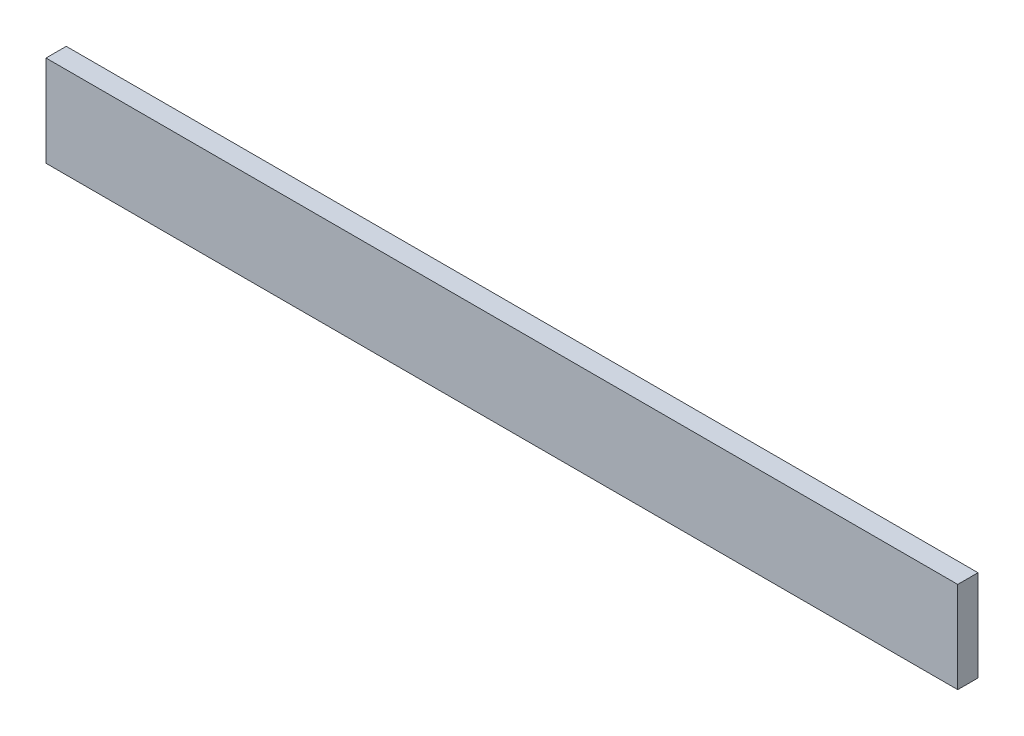
ISO-10303-21;
HEADER;
FILE_DESCRIPTION(('STEP AP214'),'2;1');
FILE_NAME('part.step','',(''),(''),'','','');
FILE_SCHEMA(('AUTOMOTIVE_DESIGN { 1 0 10303 214 1 1 1 1 }'));
ENDSEC;
DATA;
#1=APPLICATION_CONTEXT('core data for automotive mechanical design processes');
#2=APPLICATION_PROTOCOL_DEFINITION('international standard','automotive_design',2000,#1);
#3=PRODUCT_CONTEXT('',#1,'mechanical');
#4=PRODUCT('Part','Part','',(#3));
#5=PRODUCT_RELATED_PRODUCT_CATEGORY('part','',(#4));
#6=PRODUCT_DEFINITION_FORMATION('','',#4);
#7=PRODUCT_DEFINITION_CONTEXT('part definition',#1,'design');
#8=PRODUCT_DEFINITION('design','',#6,#7);
#9=PRODUCT_DEFINITION_SHAPE('','',#8);
#10=(LENGTH_UNIT() NAMED_UNIT(*) SI_UNIT(.MILLI.,.METRE.));
#11=(NAMED_UNIT(*) PLANE_ANGLE_UNIT() SI_UNIT($,.RADIAN.));
#12=(NAMED_UNIT(*) SI_UNIT($,.STERADIAN.) SOLID_ANGLE_UNIT());
#13=UNCERTAINTY_MEASURE_WITH_UNIT(LENGTH_MEASURE(1.E-05),#10,'distance_accuracy_value','');
#14=(GEOMETRIC_REPRESENTATION_CONTEXT(3) GLOBAL_UNCERTAINTY_ASSIGNED_CONTEXT((#13)) GLOBAL_UNIT_ASSIGNED_CONTEXT((#10,
#11,#12)) REPRESENTATION_CONTEXT('',''));
#15=CARTESIAN_POINT('',(0.,0.,0.));
#16=DIRECTION('',(0.,0.,1.));
#17=DIRECTION('',(1.,0.,0.));
#18=AXIS2_PLACEMENT_3D('',#15,#16,#17);
#19=CARTESIAN_POINT('',(154.666666666667,45.,-10.));
#20=DIRECTION('',(1.,0.,0.));
#21=DIRECTION('',(0.,0.,-1.));
#22=AXIS2_PLACEMENT_3D('',#19,#20,#21);
#23=PLANE('',#22);
#24=DIRECTION('',(0.,0.,1.));
#25=VECTOR('',#24,1.);
#26=CARTESIAN_POINT('',(154.666666666667,45.,-10.));
#27=LINE('',#26,#25);
#28=CARTESIAN_POINT('',(154.666666666667,45.,-10.));
#29=VERTEX_POINT('',#28);
#30=CARTESIAN_POINT('',(154.666666666667,45.,10.));
#31=VERTEX_POINT('',#30);
#32=EDGE_CURVE('E36',#29,#31,#27,.T.);
#33=ORIENTED_EDGE('',*,*,#32,.T.);
#34=DIRECTION('',(0.,1.,0.));
#35=VECTOR('',#34,1.);
#36=CARTESIAN_POINT('',(154.666666666667,45.,10.));
#37=LINE('',#36,#35);
#38=CARTESIAN_POINT('',(154.666666666667,-45.,10.));
#39=VERTEX_POINT('',#38);
#40=EDGE_CURVE('E73',#39,#31,#37,.T.);
#41=ORIENTED_EDGE('',*,*,#40,.F.);
#42=DIRECTION('',(0.,0.,1.));
#43=VECTOR('',#42,1.);
#44=CARTESIAN_POINT('',(154.666666666667,-45.,-10.));
#45=LINE('',#44,#43);
#46=CARTESIAN_POINT('',(154.666666666667,-45.,-10.));
#47=VERTEX_POINT('',#46);
#48=EDGE_CURVE('E11',#47,#39,#45,.T.);
#49=ORIENTED_EDGE('',*,*,#48,.F.);
#50=DIRECTION('',(0.,1.,0.));
#51=VECTOR('',#50,1.);
#52=CARTESIAN_POINT('',(154.666666666667,45.,-10.));
#53=LINE('',#52,#51);
#54=EDGE_CURVE('E74',#47,#29,#53,.T.);
#55=ORIENTED_EDGE('',*,*,#54,.T.);
#56=EDGE_LOOP('',(#33,#41,#49,#55));
#57=FACE_BOUND('',#56,.T.);
#58=ADVANCED_FACE('F33',(#57),#23,.T.);
#59=CARTESIAN_POINT('',(-745.333333333333,-45.,-10.));
#60=DIRECTION('',(0.,-1.,0.));
#61=DIRECTION('',(0.,0.,-1.));
#62=AXIS2_PLACEMENT_3D('',#59,#60,#61);
#63=PLANE('',#62);
#64=ORIENTED_EDGE('',*,*,#48,.T.);
#65=DIRECTION('',(1.,0.,0.));
#66=VECTOR('',#65,1.);
#67=CARTESIAN_POINT('',(-745.333333333333,-45.,10.));
#68=LINE('',#67,#66);
#69=CARTESIAN_POINT('',(-745.333333333333,-45.,10.));
#70=VERTEX_POINT('',#69);
#71=EDGE_CURVE('E90',#70,#39,#68,.T.);
#72=ORIENTED_EDGE('',*,*,#71,.F.);
#73=DIRECTION('',(0.,0.,1.));
#74=VECTOR('',#73,1.);
#75=CARTESIAN_POINT('',(-745.333333333333,-45.,-10.));
#76=LINE('',#75,#74);
#77=CARTESIAN_POINT('',(-745.333333333333,-45.,-10.));
#78=VERTEX_POINT('',#77);
#79=EDGE_CURVE('E41',#78,#70,#76,.T.);
#80=ORIENTED_EDGE('',*,*,#79,.F.);
#81=DIRECTION('',(1.,0.,0.));
#82=VECTOR('',#81,1.);
#83=CARTESIAN_POINT('',(-745.333333333333,-45.,-10.));
#84=LINE('',#83,#82);
#85=EDGE_CURVE('E79',#78,#47,#84,.T.);
#86=ORIENTED_EDGE('',*,*,#85,.T.);
#87=EDGE_LOOP('',(#64,#72,#80,#86));
#88=FACE_BOUND('',#87,.T.);
#89=ADVANCED_FACE('F105',(#88),#63,.T.);
#90=CARTESIAN_POINT('',(-745.333333333333,45.,-10.));
#91=DIRECTION('',(-1.,0.,0.));
#92=DIRECTION('',(0.,0.,1.));
#93=AXIS2_PLACEMENT_3D('',#90,#91,#92);
#94=PLANE('',#93);
#95=ORIENTED_EDGE('',*,*,#79,.T.);
#96=DIRECTION('',(0.,-1.,0.));
#97=VECTOR('',#96,1.);
#98=CARTESIAN_POINT('',(-745.333333333333,45.,10.));
#99=LINE('',#98,#97);
#100=CARTESIAN_POINT('',(-745.333333333333,45.,10.));
#101=VERTEX_POINT('',#100);
#102=EDGE_CURVE('E86',#101,#70,#99,.T.);
#103=ORIENTED_EDGE('',*,*,#102,.F.);
#104=DIRECTION('',(0.,0.,1.));
#105=VECTOR('',#104,1.);
#106=CARTESIAN_POINT('',(-745.333333333333,45.,-10.));
#107=LINE('',#106,#105);
#108=CARTESIAN_POINT('',(-745.333333333333,45.,-10.));
#109=VERTEX_POINT('',#108);
#110=EDGE_CURVE('E78',#109,#101,#107,.T.);
#111=ORIENTED_EDGE('',*,*,#110,.F.);
#112=DIRECTION('',(0.,-1.,0.));
#113=VECTOR('',#112,1.);
#114=CARTESIAN_POINT('',(-745.333333333333,45.,-10.));
#115=LINE('',#114,#113);
#116=EDGE_CURVE('E98',#109,#78,#115,.T.);
#117=ORIENTED_EDGE('',*,*,#116,.T.);
#118=EDGE_LOOP('',(#95,#103,#111,#117));
#119=FACE_BOUND('',#118,.T.);
#120=ADVANCED_FACE('F102',(#119),#94,.T.);
#121=CARTESIAN_POINT('',(-745.333333333333,45.,-10.));
#122=DIRECTION('',(0.,1.,0.));
#123=DIRECTION('',(0.,0.,1.));
#124=AXIS2_PLACEMENT_3D('',#121,#122,#123);
#125=PLANE('',#124);
#126=ORIENTED_EDGE('',*,*,#110,.T.);
#127=DIRECTION('',(-1.,0.,0.));
#128=VECTOR('',#127,1.);
#129=CARTESIAN_POINT('',(-745.333333333333,45.,10.));
#130=LINE('',#129,#128);
#131=EDGE_CURVE('E81',#31,#101,#130,.T.);
#132=ORIENTED_EDGE('',*,*,#131,.F.);
#133=ORIENTED_EDGE('',*,*,#32,.F.);
#134=DIRECTION('',(-1.,0.,0.));
#135=VECTOR('',#134,1.);
#136=CARTESIAN_POINT('',(-745.333333333333,45.,-10.));
#137=LINE('',#136,#135);
#138=EDGE_CURVE('E96',#29,#109,#137,.T.);
#139=ORIENTED_EDGE('',*,*,#138,.T.);
#140=EDGE_LOOP('',(#126,#132,#133,#139));
#141=FACE_BOUND('',#140,.T.);
#142=ADVANCED_FACE('F82',(#141),#125,.T.);
#143=CARTESIAN_POINT('',(0.,0.,-10.));
#144=DIRECTION('',(0.,0.,1.));
#145=DIRECTION('',(1.,0.,0.));
#146=AXIS2_PLACEMENT_3D('',#143,#144,#145);
#147=PLANE('',#146);
#148=ORIENTED_EDGE('',*,*,#54,.F.);
#149=ORIENTED_EDGE('',*,*,#85,.F.);
#150=ORIENTED_EDGE('',*,*,#116,.F.);
#151=ORIENTED_EDGE('',*,*,#138,.F.);
#152=EDGE_LOOP('',(#148,#149,#150,#151));
#153=FACE_BOUND('',#152,.T.);
#154=ADVANCED_FACE('F107',(#153),#147,.F.);
#155=CARTESIAN_POINT('',(0.,0.,10.));
#156=DIRECTION('',(0.,0.,1.));
#157=DIRECTION('',(1.,0.,0.));
#158=AXIS2_PLACEMENT_3D('',#155,#156,#157);
#159=PLANE('',#158);
#160=ORIENTED_EDGE('',*,*,#40,.T.);
#161=ORIENTED_EDGE('',*,*,#131,.T.);
#162=ORIENTED_EDGE('',*,*,#102,.T.);
#163=ORIENTED_EDGE('',*,*,#71,.T.);
#164=EDGE_LOOP('',(#160,#161,#162,#163));
#165=FACE_BOUND('',#164,.T.);
#166=ADVANCED_FACE('F89',(#165),#159,.T.);
#167=CLOSED_SHELL('',(#58,#89,#120,#142,#154,#166));
#168=MANIFOLD_SOLID_BREP('B2',#167);
#169=ADVANCED_BREP_SHAPE_REPRESENTATION('',(#18,#168),#14);
#170=SHAPE_DEFINITION_REPRESENTATION(#9,#169);
ENDSEC;
END-ISO-10303-21;
